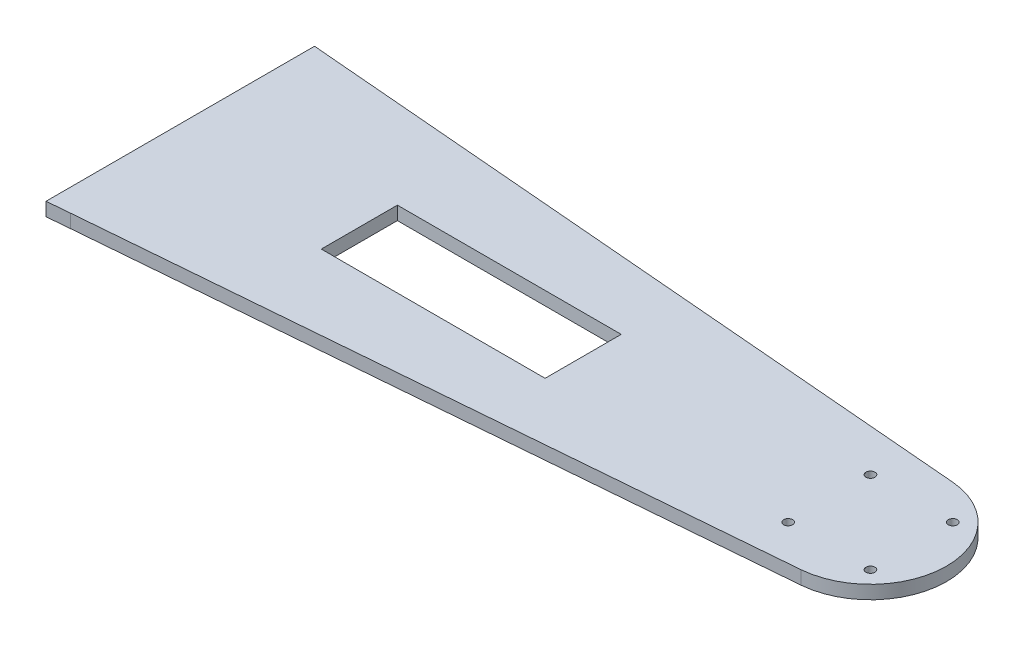
ISO-10303-21;
HEADER;
FILE_DESCRIPTION(('STEP AP214'),'2;1');
FILE_NAME('part.step','',(''),(''),'','','');
FILE_SCHEMA(('AUTOMOTIVE_DESIGN { 1 0 10303 214 1 1 1 1 }'));
ENDSEC;
DATA;
#1=APPLICATION_CONTEXT('core data for automotive mechanical design processes');
#2=APPLICATION_PROTOCOL_DEFINITION('international standard','automotive_design',2000,#1);
#3=PRODUCT_CONTEXT('',#1,'mechanical');
#4=PRODUCT('Part','Part','',(#3));
#5=PRODUCT_RELATED_PRODUCT_CATEGORY('part','',(#4));
#6=PRODUCT_DEFINITION_FORMATION('','',#4);
#7=PRODUCT_DEFINITION_CONTEXT('part definition',#1,'design');
#8=PRODUCT_DEFINITION('design','',#6,#7);
#9=PRODUCT_DEFINITION_SHAPE('','',#8);
#10=(LENGTH_UNIT() NAMED_UNIT(*) SI_UNIT(.MILLI.,.METRE.));
#11=(NAMED_UNIT(*) PLANE_ANGLE_UNIT() SI_UNIT($,.RADIAN.));
#12=(NAMED_UNIT(*) SI_UNIT($,.STERADIAN.) SOLID_ANGLE_UNIT());
#13=UNCERTAINTY_MEASURE_WITH_UNIT(LENGTH_MEASURE(1.E-05),#10,'distance_accuracy_value','');
#14=(GEOMETRIC_REPRESENTATION_CONTEXT(3) GLOBAL_UNCERTAINTY_ASSIGNED_CONTEXT((#13)) GLOBAL_UNIT_ASSIGNED_CONTEXT((#10,
#11,#12)) REPRESENTATION_CONTEXT('',''));
#15=CARTESIAN_POINT('',(0.,0.,0.));
#16=DIRECTION('',(0.,0.,1.));
#17=DIRECTION('',(1.,0.,0.));
#18=AXIS2_PLACEMENT_3D('',#15,#16,#17);
#19=CARTESIAN_POINT('',(149.192388155425,3.,-29.5625566823704));
#20=DIRECTION('',(0.,-1.,0.));
#21=DIRECTION('',(0.,0.,-1.));
#22=AXIS2_PLACEMENT_3D('',#19,#20,#21);
#23=PLANE('',#22);
#24=DIRECTION('',(1.,0.,0.));
#25=VECTOR('',#24,1.);
#26=CARTESIAN_POINT('',(35.,3.,-21.0625566823704));
#27=LINE('',#26,#25);
#28=CARTESIAN_POINT('',(35.,3.,-21.0625566823704));
#29=VERTEX_POINT('',#28);
#30=CARTESIAN_POINT('',(85.,3.,-21.0625566823704));
#31=VERTEX_POINT('',#30);
#32=EDGE_CURVE('E138',#29,#31,#27,.T.);
#33=ORIENTED_EDGE('',*,*,#32,.F.);
#34=DIRECTION('',(0.,0.,1.));
#35=VECTOR('',#34,1.);
#36=CARTESIAN_POINT('',(35.,3.,-38.0625566823704));
#37=LINE('',#36,#35);
#38=CARTESIAN_POINT('',(35.,3.,-38.0625566823704));
#39=VERTEX_POINT('',#38);
#40=EDGE_CURVE('E49',#39,#29,#37,.T.);
#41=ORIENTED_EDGE('',*,*,#40,.F.);
#42=DIRECTION('',(-1.,0.,0.));
#43=VECTOR('',#42,1.);
#44=CARTESIAN_POINT('',(35.,3.,-38.0625566823704));
#45=LINE('',#44,#43);
#46=CARTESIAN_POINT('',(85.,3.,-38.0625566823704));
#47=VERTEX_POINT('',#46);
#48=EDGE_CURVE('E129',#47,#39,#45,.T.);
#49=ORIENTED_EDGE('',*,*,#48,.F.);
#50=DIRECTION('',(0.,0.,-1.));
#51=VECTOR('',#50,1.);
#52=CARTESIAN_POINT('',(85.,3.,-38.0625566823704));
#53=LINE('',#52,#51);
#54=EDGE_CURVE('E132',#31,#47,#53,.T.);
#55=ORIENTED_EDGE('',*,*,#54,.F.);
#56=EDGE_LOOP('',(#33,#41,#49,#55));
#57=FACE_BOUND('',#56,.T.);
#58=DIRECTION('',(0.996194698091746,0.,-0.0871557427476517));
#59=VECTOR('',#58,1.);
#60=CARTESIAN_POINT('',(-4.99999999999999,3.,0.437443317629587));
#61=LINE('',#60,#59);
#62=CARTESIAN_POINT('',(-4.99999999999999,3.,0.437443317629587));
#63=VERTEX_POINT('',#62);
#64=CARTESIAN_POINT('',(0.,3.,0.));
#65=VERTEX_POINT('',#64);
#66=EDGE_CURVE('E172',#63,#65,#61,.T.);
#67=ORIENTED_EDGE('',*,*,#66,.T.);
#68=DIRECTION('',(0.996506808515565,0.,-0.0835115595718573));
#69=VECTOR('',#68,1.);
#70=CARTESIAN_POINT('',(0.,3.,0.));
#71=LINE('',#70,#69);
#72=CARTESIAN_POINT('',(150.612084668147,3.,-12.6219409376058));
#73=VERTEX_POINT('',#72);
#74=EDGE_CURVE('E175',#65,#73,#71,.T.);
#75=ORIENTED_EDGE('',*,*,#74,.T.);
#76=CARTESIAN_POINT('',(149.192388155425,3.,-29.5625566823704));
#77=DIRECTION('',(0.,1.,0.));
#78=DIRECTION('',(0.,0.,-1.));
#79=AXIS2_PLACEMENT_3D('',#76,#77,#78);
#80=CIRCLE('',#79,17.);
#81=CARTESIAN_POINT('',(150.612084668147,3.,-46.503172427135));
#82=VERTEX_POINT('',#81);
#83=EDGE_CURVE('E178',#73,#82,#80,.T.);
#84=ORIENTED_EDGE('',*,*,#83,.T.);
#85=DIRECTION('',(-0.996506808515565,0.,-0.0835115595718571));
#86=VECTOR('',#85,1.);
#87=CARTESIAN_POINT('',(150.612084668147,3.,-46.503172427135));
#88=LINE('',#87,#86);
#89=CARTESIAN_POINT('',(0.,3.,-59.1251133647408));
#90=VERTEX_POINT('',#89);
#91=EDGE_CURVE('E180',#82,#90,#88,.T.);
#92=ORIENTED_EDGE('',*,*,#91,.T.);
#93=DIRECTION('',(-0.996194698091746,0.,-0.0871557427476514));
#94=VECTOR('',#93,1.);
#95=CARTESIAN_POINT('',(0.,3.,-59.1251133647408));
#96=LINE('',#95,#94);
#97=CARTESIAN_POINT('',(-5.,3.,-59.5625566823704));
#98=VERTEX_POINT('',#97);
#99=EDGE_CURVE('E182',#90,#98,#96,.T.);
#100=ORIENTED_EDGE('',*,*,#99,.T.);
#101=DIRECTION('',(0.,0.,1.));
#102=VECTOR('',#101,1.);
#103=CARTESIAN_POINT('',(-5.,3.,-59.5625566823704));
#104=LINE('',#103,#102);
#105=EDGE_CURVE('E184',#98,#63,#104,.T.);
#106=ORIENTED_EDGE('',*,*,#105,.T.);
#107=EDGE_LOOP('',(#67,#75,#84,#92,#100,#106));
#108=FACE_BOUND('',#107,.T.);
#109=CARTESIAN_POINT('',(140.,3.,-20.3701685269453));
#110=DIRECTION('',(0.,1.,0.));
#111=DIRECTION('',(0.,0.,1.));
#112=AXIS2_PLACEMENT_3D('',#109,#110,#111);
#113=CIRCLE('',#112,1.00000000000003);
#114=CARTESIAN_POINT('',(140.,3.,-19.3701685269452));
#115=VERTEX_POINT('',#114);
#116=EDGE_CURVE('E166',#115,#115,#113,.T.);
#117=ORIENTED_EDGE('',*,*,#116,.F.);
#118=EDGE_LOOP('',(#117));
#119=FACE_BOUND('',#118,.T.);
#120=CARTESIAN_POINT('',(158.38477631085,3.,-20.3701685269454));
#121=DIRECTION('',(0.,1.,0.));
#122=DIRECTION('',(0.,0.,1.));
#123=AXIS2_PLACEMENT_3D('',#120,#121,#122);
#124=CIRCLE('',#123,1.00000000000008);
#125=CARTESIAN_POINT('',(158.38477631085,3.,-19.3701685269453));
#126=VERTEX_POINT('',#125);
#127=EDGE_CURVE('E160',#126,#126,#124,.T.);
#128=ORIENTED_EDGE('',*,*,#127,.F.);
#129=EDGE_LOOP('',(#128));
#130=FACE_BOUND('',#129,.T.);
#131=CARTESIAN_POINT('',(158.38477631085,3.,-38.7549448377956));
#132=DIRECTION('',(0.,1.,0.));
#133=DIRECTION('',(0.,0.,1.));
#134=AXIS2_PLACEMENT_3D('',#131,#132,#133);
#135=CIRCLE('',#134,1.00000000000002);
#136=CARTESIAN_POINT('',(158.38477631085,3.,-37.7549448377956));
#137=VERTEX_POINT('',#136);
#138=EDGE_CURVE('E154',#137,#137,#135,.T.);
#139=ORIENTED_EDGE('',*,*,#138,.F.);
#140=EDGE_LOOP('',(#139));
#141=FACE_BOUND('',#140,.T.);
#142=CARTESIAN_POINT('',(140.,3.,-38.7549448377955));
#143=DIRECTION('',(0.,1.,0.));
#144=DIRECTION('',(0.,0.,1.));
#145=AXIS2_PLACEMENT_3D('',#142,#143,#144);
#146=CIRCLE('',#145,1.00000000000003);
#147=CARTESIAN_POINT('',(140.,3.,-37.7549448377955));
#148=VERTEX_POINT('',#147);
#149=EDGE_CURVE('E148',#148,#148,#146,.T.);
#150=ORIENTED_EDGE('',*,*,#149,.F.);
#151=EDGE_LOOP('',(#150));
#152=FACE_BOUND('',#151,.T.);
#153=ADVANCED_FACE('F34',(#57,#108,#119,#130,#141,#152),#23,.F.);
#154=CARTESIAN_POINT('',(149.192388155425,0.,-29.5625566823704));
#155=DIRECTION('',(0.,-1.,0.));
#156=DIRECTION('',(0.,0.,-1.));
#157=AXIS2_PLACEMENT_3D('',#154,#155,#156);
#158=PLANE('',#157);
#159=DIRECTION('',(0.,0.,1.));
#160=VECTOR('',#159,1.);
#161=CARTESIAN_POINT('',(35.,0.,-38.0625566823704));
#162=LINE('',#161,#160);
#163=CARTESIAN_POINT('',(35.,0.,-38.0625566823704));
#164=VERTEX_POINT('',#163);
#165=CARTESIAN_POINT('',(35.,0.,-21.0625566823704));
#166=VERTEX_POINT('',#165);
#167=EDGE_CURVE('E113',#164,#166,#162,.T.);
#168=ORIENTED_EDGE('',*,*,#167,.T.);
#169=DIRECTION('',(1.,0.,0.));
#170=VECTOR('',#169,1.);
#171=CARTESIAN_POINT('',(35.,0.,-21.0625566823704));
#172=LINE('',#171,#170);
#173=CARTESIAN_POINT('',(85.,0.,-21.0625566823704));
#174=VERTEX_POINT('',#173);
#175=EDGE_CURVE('E122',#166,#174,#172,.T.);
#176=ORIENTED_EDGE('',*,*,#175,.T.);
#177=DIRECTION('',(0.,0.,-1.));
#178=VECTOR('',#177,1.);
#179=CARTESIAN_POINT('',(85.,0.,-38.0625566823704));
#180=LINE('',#179,#178);
#181=CARTESIAN_POINT('',(85.,0.,-38.0625566823704));
#182=VERTEX_POINT('',#181);
#183=EDGE_CURVE('E57',#174,#182,#180,.T.);
#184=ORIENTED_EDGE('',*,*,#183,.T.);
#185=DIRECTION('',(-1.,0.,0.));
#186=VECTOR('',#185,1.);
#187=CARTESIAN_POINT('',(35.,0.,-38.0625566823704));
#188=LINE('',#187,#186);
#189=EDGE_CURVE('E119',#182,#164,#188,.T.);
#190=ORIENTED_EDGE('',*,*,#189,.T.);
#191=EDGE_LOOP('',(#168,#176,#184,#190));
#192=FACE_BOUND('',#191,.T.);
#193=CARTESIAN_POINT('',(158.38477631085,0.,-38.7549448377956));
#194=DIRECTION('',(0.,1.,0.));
#195=DIRECTION('',(0.,0.,1.));
#196=AXIS2_PLACEMENT_3D('',#193,#194,#195);
#197=CIRCLE('',#196,1.00000000000002);
#198=CARTESIAN_POINT('',(158.38477631085,0.,-37.7549448377956));
#199=VERTEX_POINT('',#198);
#200=EDGE_CURVE('E151',#199,#199,#197,.T.);
#201=ORIENTED_EDGE('',*,*,#200,.T.);
#202=EDGE_LOOP('',(#201));
#203=FACE_BOUND('',#202,.T.);
#204=CARTESIAN_POINT('',(140.,0.,-20.3701685269453));
#205=DIRECTION('',(0.,1.,0.));
#206=DIRECTION('',(0.,0.,1.));
#207=AXIS2_PLACEMENT_3D('',#204,#205,#206);
#208=CIRCLE('',#207,1.00000000000003);
#209=CARTESIAN_POINT('',(140.,0.,-19.3701685269452));
#210=VERTEX_POINT('',#209);
#211=EDGE_CURVE('E163',#210,#210,#208,.T.);
#212=ORIENTED_EDGE('',*,*,#211,.T.);
#213=EDGE_LOOP('',(#212));
#214=FACE_BOUND('',#213,.T.);
#215=DIRECTION('',(0.996194698091746,0.,-0.0871557427476517));
#216=VECTOR('',#215,1.);
#217=CARTESIAN_POINT('',(-4.99999999999999,0.,0.437443317629587));
#218=LINE('',#217,#216);
#219=CARTESIAN_POINT('',(-4.99999999999999,0.,0.437443317629587));
#220=VERTEX_POINT('',#219);
#221=CARTESIAN_POINT('',(0.,0.,0.));
#222=VERTEX_POINT('',#221);
#223=EDGE_CURVE('E169',#220,#222,#218,.T.);
#224=ORIENTED_EDGE('',*,*,#223,.F.);
#225=DIRECTION('',(0.,0.,1.));
#226=VECTOR('',#225,1.);
#227=CARTESIAN_POINT('',(-5.,0.,-59.5625566823704));
#228=LINE('',#227,#226);
#229=CARTESIAN_POINT('',(-5.,0.,-59.5625566823704));
#230=VERTEX_POINT('',#229);
#231=EDGE_CURVE('E176',#230,#220,#228,.T.);
#232=ORIENTED_EDGE('',*,*,#231,.F.);
#233=DIRECTION('',(-0.996194698091746,0.,-0.0871557427476514));
#234=VECTOR('',#233,1.);
#235=CARTESIAN_POINT('',(0.,0.,-59.1251133647408));
#236=LINE('',#235,#234);
#237=CARTESIAN_POINT('',(0.,0.,-59.1251133647408));
#238=VERTEX_POINT('',#237);
#239=EDGE_CURVE('E195',#238,#230,#236,.T.);
#240=ORIENTED_EDGE('',*,*,#239,.F.);
#241=DIRECTION('',(-0.996506808515565,0.,-0.0835115595718571));
#242=VECTOR('',#241,1.);
#243=CARTESIAN_POINT('',(150.612084668147,0.,-46.503172427135));
#244=LINE('',#243,#242);
#245=CARTESIAN_POINT('',(150.612084668147,0.,-46.503172427135));
#246=VERTEX_POINT('',#245);
#247=EDGE_CURVE('E193',#246,#238,#244,.T.);
#248=ORIENTED_EDGE('',*,*,#247,.F.);
#249=CARTESIAN_POINT('',(149.192388155425,0.,-29.5625566823704));
#250=DIRECTION('',(0.,1.,0.));
#251=DIRECTION('',(0.,0.,-1.));
#252=AXIS2_PLACEMENT_3D('',#249,#250,#251);
#253=CIRCLE('',#252,17.);
#254=CARTESIAN_POINT('',(150.612084668147,0.,-12.6219409376058));
#255=VERTEX_POINT('',#254);
#256=EDGE_CURVE('E191',#255,#246,#253,.T.);
#257=ORIENTED_EDGE('',*,*,#256,.F.);
#258=DIRECTION('',(0.996506808515565,0.,-0.0835115595718573));
#259=VECTOR('',#258,1.);
#260=CARTESIAN_POINT('',(0.,0.,0.));
#261=LINE('',#260,#259);
#262=EDGE_CURVE('E189',#222,#255,#261,.T.);
#263=ORIENTED_EDGE('',*,*,#262,.F.);
#264=EDGE_LOOP('',(#224,#232,#240,#248,#257,#263));
#265=FACE_BOUND('',#264,.T.);
#266=CARTESIAN_POINT('',(158.38477631085,0.,-20.3701685269454));
#267=DIRECTION('',(0.,1.,0.));
#268=DIRECTION('',(0.,0.,1.));
#269=AXIS2_PLACEMENT_3D('',#266,#267,#268);
#270=CIRCLE('',#269,1.00000000000008);
#271=CARTESIAN_POINT('',(158.38477631085,0.,-19.3701685269453));
#272=VERTEX_POINT('',#271);
#273=EDGE_CURVE('E157',#272,#272,#270,.T.);
#274=ORIENTED_EDGE('',*,*,#273,.T.);
#275=EDGE_LOOP('',(#274));
#276=FACE_BOUND('',#275,.T.);
#277=CARTESIAN_POINT('',(140.,0.,-38.7549448377955));
#278=DIRECTION('',(0.,1.,0.));
#279=DIRECTION('',(0.,0.,1.));
#280=AXIS2_PLACEMENT_3D('',#277,#278,#279);
#281=CIRCLE('',#280,1.00000000000003);
#282=CARTESIAN_POINT('',(140.,0.,-37.7549448377955));
#283=VERTEX_POINT('',#282);
#284=EDGE_CURVE('E144',#283,#283,#281,.T.);
#285=ORIENTED_EDGE('',*,*,#284,.T.);
#286=EDGE_LOOP('',(#285));
#287=FACE_BOUND('',#286,.T.);
#288=ADVANCED_FACE('F126',(#192,#203,#214,#265,#276,#287),#158,.T.);
#289=CARTESIAN_POINT('',(-4.99999999999999,3.,0.437443317629587));
#290=DIRECTION('',(-0.0871557427476517,0.,-0.996194698091746));
#291=DIRECTION('',(-0.996194698091746,0.,0.0871557427476517));
#292=AXIS2_PLACEMENT_3D('',#289,#290,#291);
#293=PLANE('',#292);
#294=ORIENTED_EDGE('',*,*,#223,.T.);
#295=DIRECTION('',(0.,-1.,0.));
#296=VECTOR('',#295,1.);
#297=CARTESIAN_POINT('',(0.,3.,0.));
#298=LINE('',#297,#296);
#299=EDGE_CURVE('E11',#65,#222,#298,.T.);
#300=ORIENTED_EDGE('',*,*,#299,.F.);
#301=ORIENTED_EDGE('',*,*,#66,.F.);
#302=DIRECTION('',(0.,-1.,0.));
#303=VECTOR('',#302,1.);
#304=CARTESIAN_POINT('',(-4.99999999999999,3.,0.437443317629587));
#305=LINE('',#304,#303);
#306=EDGE_CURVE('E186',#63,#220,#305,.T.);
#307=ORIENTED_EDGE('',*,*,#306,.T.);
#308=EDGE_LOOP('',(#294,#300,#301,#307));
#309=FACE_BOUND('',#308,.T.);
#310=ADVANCED_FACE('F36',(#309),#293,.F.);
#311=CARTESIAN_POINT('',(0.,3.,0.));
#312=DIRECTION('',(-0.0835115595718573,0.,-0.996506808515565));
#313=DIRECTION('',(-0.996506808515565,0.,0.0835115595718573));
#314=AXIS2_PLACEMENT_3D('',#311,#312,#313);
#315=PLANE('',#314);
#316=ORIENTED_EDGE('',*,*,#262,.T.);
#317=DIRECTION('',(0.,-1.,0.));
#318=VECTOR('',#317,1.);
#319=CARTESIAN_POINT('',(150.612084668147,3.,-12.6219409376058));
#320=LINE('',#319,#318);
#321=EDGE_CURVE('E42',#73,#255,#320,.T.);
#322=ORIENTED_EDGE('',*,*,#321,.F.);
#323=ORIENTED_EDGE('',*,*,#74,.F.);
#324=ORIENTED_EDGE('',*,*,#299,.T.);
#325=EDGE_LOOP('',(#316,#322,#323,#324));
#326=FACE_BOUND('',#325,.T.);
#327=ADVANCED_FACE('F236',(#326),#315,.F.);
#328=CARTESIAN_POINT('',(149.192388155425,3.,-29.5625566823704));
#329=DIRECTION('',(0.,-1.,0.));
#330=DIRECTION('',(0.,0.,-1.));
#331=AXIS2_PLACEMENT_3D('',#328,#329,#330);
#332=CYLINDRICAL_SURFACE('',#331,17.);
#333=ORIENTED_EDGE('',*,*,#256,.T.);
#334=DIRECTION('',(0.,-1.,0.));
#335=VECTOR('',#334,1.);
#336=CARTESIAN_POINT('',(150.612084668147,3.,-46.503172427135));
#337=LINE('',#336,#335);
#338=EDGE_CURVE('E206',#82,#246,#337,.T.);
#339=ORIENTED_EDGE('',*,*,#338,.F.);
#340=ORIENTED_EDGE('',*,*,#83,.F.);
#341=ORIENTED_EDGE('',*,*,#321,.T.);
#342=EDGE_LOOP('',(#333,#339,#340,#341));
#343=FACE_BOUND('',#342,.T.);
#344=ADVANCED_FACE('F213',(#343),#332,.T.);
#345=CARTESIAN_POINT('',(150.612084668147,3.,-46.503172427135));
#346=DIRECTION('',(-0.083511559571857,0.,0.996506808515565));
#347=DIRECTION('',(0.996506808515565,0.,0.083511559571857));
#348=AXIS2_PLACEMENT_3D('',#345,#346,#347);
#349=PLANE('',#348);
#350=ORIENTED_EDGE('',*,*,#247,.T.);
#351=DIRECTION('',(0.,-1.,0.));
#352=VECTOR('',#351,1.);
#353=CARTESIAN_POINT('',(0.,3.,-59.1251133647408));
#354=LINE('',#353,#352);
#355=EDGE_CURVE('E203',#90,#238,#354,.T.);
#356=ORIENTED_EDGE('',*,*,#355,.F.);
#357=ORIENTED_EDGE('',*,*,#91,.F.);
#358=ORIENTED_EDGE('',*,*,#338,.T.);
#359=EDGE_LOOP('',(#350,#356,#357,#358));
#360=FACE_BOUND('',#359,.T.);
#361=ADVANCED_FACE('F224',(#360),#349,.F.);
#362=CARTESIAN_POINT('',(0.,3.,-59.1251133647408));
#363=DIRECTION('',(-0.0871557427476514,0.,0.996194698091746));
#364=DIRECTION('',(0.996194698091746,0.,0.0871557427476514));
#365=AXIS2_PLACEMENT_3D('',#362,#363,#364);
#366=PLANE('',#365);
#367=ORIENTED_EDGE('',*,*,#239,.T.);
#368=DIRECTION('',(0.,-1.,0.));
#369=VECTOR('',#368,1.);
#370=CARTESIAN_POINT('',(-5.,3.,-59.5625566823704));
#371=LINE('',#370,#369);
#372=EDGE_CURVE('E200',#98,#230,#371,.T.);
#373=ORIENTED_EDGE('',*,*,#372,.F.);
#374=ORIENTED_EDGE('',*,*,#99,.F.);
#375=ORIENTED_EDGE('',*,*,#355,.T.);
#376=EDGE_LOOP('',(#367,#373,#374,#375));
#377=FACE_BOUND('',#376,.T.);
#378=ADVANCED_FACE('F228',(#377),#366,.F.);
#379=CARTESIAN_POINT('',(-5.,3.,-59.5625566823704));
#380=DIRECTION('',(1.,0.,0.));
#381=DIRECTION('',(0.,0.,-1.));
#382=AXIS2_PLACEMENT_3D('',#379,#380,#381);
#383=PLANE('',#382);
#384=ORIENTED_EDGE('',*,*,#231,.T.);
#385=ORIENTED_EDGE('',*,*,#306,.F.);
#386=ORIENTED_EDGE('',*,*,#105,.F.);
#387=ORIENTED_EDGE('',*,*,#372,.T.);
#388=EDGE_LOOP('',(#384,#385,#386,#387));
#389=FACE_BOUND('',#388,.T.);
#390=ADVANCED_FACE('F239',(#389),#383,.F.);
#391=CARTESIAN_POINT('',(140.,3.,-20.3701685269453));
#392=DIRECTION('',(0.,-1.,0.));
#393=DIRECTION('',(0.,0.,-1.));
#394=AXIS2_PLACEMENT_3D('',#391,#392,#393);
#395=CYLINDRICAL_SURFACE('',#394,1.00000000000003);
#396=ORIENTED_EDGE('',*,*,#116,.T.);
#397=EDGE_LOOP('',(#396));
#398=FACE_BOUND('',#397,.T.);
#399=ORIENTED_EDGE('',*,*,#211,.F.);
#400=EDGE_LOOP('',(#399));
#401=FACE_BOUND('',#400,.T.);
#402=ADVANCED_FACE('F241',(#398,#401),#395,.F.);
#403=CARTESIAN_POINT('',(158.38477631085,3.,-20.3701685269454));
#404=DIRECTION('',(0.,-1.,0.));
#405=DIRECTION('',(0.,0.,-1.));
#406=AXIS2_PLACEMENT_3D('',#403,#404,#405);
#407=CYLINDRICAL_SURFACE('',#406,1.00000000000008);
#408=ORIENTED_EDGE('',*,*,#127,.T.);
#409=EDGE_LOOP('',(#408));
#410=FACE_BOUND('',#409,.T.);
#411=ORIENTED_EDGE('',*,*,#273,.F.);
#412=EDGE_LOOP('',(#411));
#413=FACE_BOUND('',#412,.T.);
#414=ADVANCED_FACE('F247',(#410,#413),#407,.F.);
#415=CARTESIAN_POINT('',(158.38477631085,3.,-38.7549448377956));
#416=DIRECTION('',(0.,-1.,0.));
#417=DIRECTION('',(0.,0.,-1.));
#418=AXIS2_PLACEMENT_3D('',#415,#416,#417);
#419=CYLINDRICAL_SURFACE('',#418,1.00000000000002);
#420=ORIENTED_EDGE('',*,*,#138,.T.);
#421=EDGE_LOOP('',(#420));
#422=FACE_BOUND('',#421,.T.);
#423=ORIENTED_EDGE('',*,*,#200,.F.);
#424=EDGE_LOOP('',(#423));
#425=FACE_BOUND('',#424,.T.);
#426=ADVANCED_FACE('F261',(#422,#425),#419,.F.);
#427=CARTESIAN_POINT('',(140.,3.,-38.7549448377955));
#428=DIRECTION('',(0.,-1.,0.));
#429=DIRECTION('',(0.,0.,-1.));
#430=AXIS2_PLACEMENT_3D('',#427,#428,#429);
#431=CYLINDRICAL_SURFACE('',#430,1.00000000000003);
#432=ORIENTED_EDGE('',*,*,#149,.T.);
#433=EDGE_LOOP('',(#432));
#434=FACE_BOUND('',#433,.T.);
#435=ORIENTED_EDGE('',*,*,#284,.F.);
#436=EDGE_LOOP('',(#435));
#437=FACE_BOUND('',#436,.T.);
#438=ADVANCED_FACE('F265',(#434,#437),#431,.F.);
#439=CARTESIAN_POINT('',(35.,0.,-38.0625566823704));
#440=DIRECTION('',(-1.,0.,0.));
#441=DIRECTION('',(0.,0.,1.));
#442=AXIS2_PLACEMENT_3D('',#439,#440,#441);
#443=PLANE('',#442);
#444=ORIENTED_EDGE('',*,*,#40,.T.);
#445=DIRECTION('',(0.,1.,0.));
#446=VECTOR('',#445,1.);
#447=CARTESIAN_POINT('',(35.,0.,-21.0625566823704));
#448=LINE('',#447,#446);
#449=EDGE_CURVE('E109',#166,#29,#448,.T.);
#450=ORIENTED_EDGE('',*,*,#449,.F.);
#451=ORIENTED_EDGE('',*,*,#167,.F.);
#452=DIRECTION('',(0.,1.,0.));
#453=VECTOR('',#452,1.);
#454=CARTESIAN_POINT('',(35.,0.,-38.0625566823704));
#455=LINE('',#454,#453);
#456=EDGE_CURVE('E142',#164,#39,#455,.T.);
#457=ORIENTED_EDGE('',*,*,#456,.T.);
#458=EDGE_LOOP('',(#444,#450,#451,#457));
#459=FACE_BOUND('',#458,.T.);
#460=ADVANCED_FACE('F111',(#459),#443,.F.);
#461=CARTESIAN_POINT('',(35.,0.,-38.0625566823704));
#462=DIRECTION('',(0.,0.,-1.));
#463=DIRECTION('',(-1.,0.,0.));
#464=AXIS2_PLACEMENT_3D('',#461,#462,#463);
#465=PLANE('',#464);
#466=ORIENTED_EDGE('',*,*,#48,.T.);
#467=ORIENTED_EDGE('',*,*,#456,.F.);
#468=ORIENTED_EDGE('',*,*,#189,.F.);
#469=DIRECTION('',(0.,1.,0.));
#470=VECTOR('',#469,1.);
#471=CARTESIAN_POINT('',(85.,0.,-38.0625566823704));
#472=LINE('',#471,#470);
#473=EDGE_CURVE('E145',#182,#47,#472,.T.);
#474=ORIENTED_EDGE('',*,*,#473,.T.);
#475=EDGE_LOOP('',(#466,#467,#468,#474));
#476=FACE_BOUND('',#475,.T.);
#477=ADVANCED_FACE('F272',(#476),#465,.F.);
#478=CARTESIAN_POINT('',(85.,0.,-38.0625566823704));
#479=DIRECTION('',(1.,0.,0.));
#480=DIRECTION('',(0.,0.,-1.));
#481=AXIS2_PLACEMENT_3D('',#478,#479,#480);
#482=PLANE('',#481);
#483=ORIENTED_EDGE('',*,*,#54,.T.);
#484=ORIENTED_EDGE('',*,*,#473,.F.);
#485=ORIENTED_EDGE('',*,*,#183,.F.);
#486=DIRECTION('',(0.,1.,0.));
#487=VECTOR('',#486,1.);
#488=CARTESIAN_POINT('',(85.,0.,-21.0625566823704));
#489=LINE('',#488,#487);
#490=EDGE_CURVE('E118',#174,#31,#489,.T.);
#491=ORIENTED_EDGE('',*,*,#490,.T.);
#492=EDGE_LOOP('',(#483,#484,#485,#491));
#493=FACE_BOUND('',#492,.T.);
#494=ADVANCED_FACE('F275',(#493),#482,.F.);
#495=CARTESIAN_POINT('',(35.,0.,-21.0625566823704));
#496=DIRECTION('',(0.,0.,1.));
#497=DIRECTION('',(1.,0.,0.));
#498=AXIS2_PLACEMENT_3D('',#495,#496,#497);
#499=PLANE('',#498);
#500=ORIENTED_EDGE('',*,*,#32,.T.);
#501=ORIENTED_EDGE('',*,*,#490,.F.);
#502=ORIENTED_EDGE('',*,*,#175,.F.);
#503=ORIENTED_EDGE('',*,*,#449,.T.);
#504=EDGE_LOOP('',(#500,#501,#502,#503));
#505=FACE_BOUND('',#504,.T.);
#506=ADVANCED_FACE('F123',(#505),#499,.F.);
#507=CLOSED_SHELL('',(#153,#288,#310,#327,#344,#361,#378,#390,#402,#414,#426,#438,#460,#477,
#494,#506));
#508=MANIFOLD_SOLID_BREP('B2',#507);
#509=ADVANCED_BREP_SHAPE_REPRESENTATION('',(#18,#508),#14);
#510=SHAPE_DEFINITION_REPRESENTATION(#9,#509);
ENDSEC;
END-ISO-10303-21;
